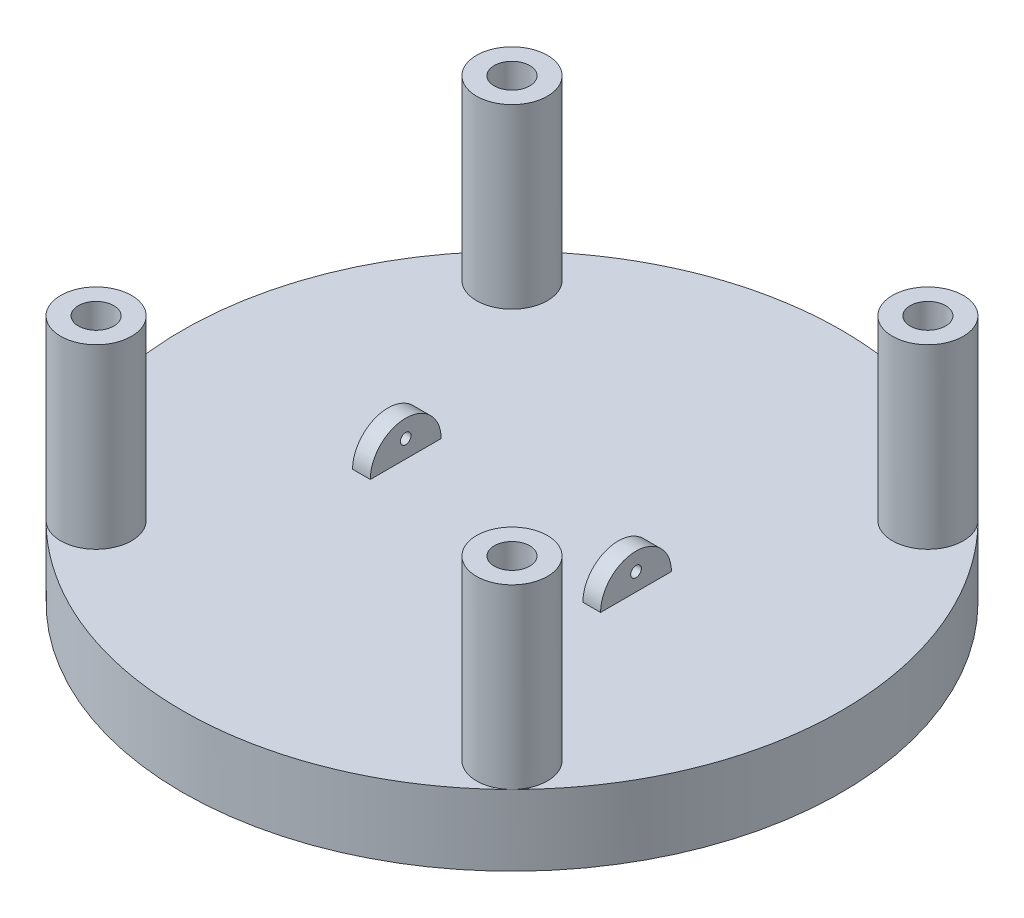
ISO-10303-21;
HEADER;
FILE_DESCRIPTION(('STEP AP214'),'2;1');
FILE_NAME('part.step','',(''),(''),'','','');
FILE_SCHEMA(('AUTOMOTIVE_DESIGN { 1 0 10303 214 1 1 1 1 }'));
ENDSEC;
DATA;
#1=APPLICATION_CONTEXT('core data for automotive mechanical design processes');
#2=APPLICATION_PROTOCOL_DEFINITION('international standard','automotive_design',2000,#1);
#3=PRODUCT_CONTEXT('',#1,'mechanical');
#4=PRODUCT('Part','Part','',(#3));
#5=PRODUCT_RELATED_PRODUCT_CATEGORY('part','',(#4));
#6=PRODUCT_DEFINITION_FORMATION('','',#4);
#7=PRODUCT_DEFINITION_CONTEXT('part definition',#1,'design');
#8=PRODUCT_DEFINITION('design','',#6,#7);
#9=PRODUCT_DEFINITION_SHAPE('','',#8);
#10=(LENGTH_UNIT() NAMED_UNIT(*) SI_UNIT(.MILLI.,.METRE.));
#11=(NAMED_UNIT(*) PLANE_ANGLE_UNIT() SI_UNIT($,.RADIAN.));
#12=(NAMED_UNIT(*) SI_UNIT($,.STERADIAN.) SOLID_ANGLE_UNIT());
#13=UNCERTAINTY_MEASURE_WITH_UNIT(LENGTH_MEASURE(1.E-05),#10,'distance_accuracy_value','');
#14=(GEOMETRIC_REPRESENTATION_CONTEXT(3) GLOBAL_UNCERTAINTY_ASSIGNED_CONTEXT((#13)) GLOBAL_UNIT_ASSIGNED_CONTEXT((#10,
#11,#12)) REPRESENTATION_CONTEXT('',''));
#15=CARTESIAN_POINT('',(0.,0.,0.));
#16=DIRECTION('',(0.,0.,1.));
#17=DIRECTION('',(1.,0.,0.));
#18=AXIS2_PLACEMENT_3D('',#15,#16,#17);
#19=CARTESIAN_POINT('',(0.,17.,0.));
#20=DIRECTION('',(0.,1.,0.));
#21=DIRECTION('',(0.,0.,1.));
#22=AXIS2_PLACEMENT_3D('',#19,#20,#21);
#23=PLANE('',#22);
#24=CARTESIAN_POINT('',(0.,17.,0.));
#25=DIRECTION('',(0.,1.,0.));
#26=DIRECTION('',(0.,0.,1.));
#27=AXIS2_PLACEMENT_3D('',#24,#25,#26);
#28=CIRCLE('',#27,90.);
#29=CARTESIAN_POINT('',(0.,17.,90.));
#30=VERTEX_POINT('',#29);
#31=EDGE_CURVE('E253',#30,#30,#28,.T.);
#32=ORIENTED_EDGE('',*,*,#31,.F.);
#33=EDGE_LOOP('',(#32));
#34=FACE_BOUND('',#33,.T.);
#35=DIRECTION('',(-1.,0.,0.));
#36=VECTOR('',#35,1.);
#37=CARTESIAN_POINT('',(-20.,17.,80.));
#38=LINE('',#37,#36);
#39=CARTESIAN_POINT('',(20.,17.,80.));
#40=VERTEX_POINT('',#39);
#41=CARTESIAN_POINT('',(-20.,17.,80.));
#42=VERTEX_POINT('',#41);
#43=EDGE_CURVE('E197',#40,#42,#38,.T.);
#44=ORIENTED_EDGE('',*,*,#43,.F.);
#45=DIRECTION('',(0.,0.,1.));
#46=VECTOR('',#45,1.);
#47=CARTESIAN_POINT('',(20.,17.,40.));
#48=LINE('',#47,#46);
#49=CARTESIAN_POINT('',(20.,17.,40.));
#50=VERTEX_POINT('',#49);
#51=EDGE_CURVE('E178',#50,#40,#48,.T.);
#52=ORIENTED_EDGE('',*,*,#51,.F.);
#53=DIRECTION('',(1.,0.,0.));
#54=VECTOR('',#53,1.);
#55=CARTESIAN_POINT('',(-20.,17.,40.));
#56=LINE('',#55,#54);
#57=CARTESIAN_POINT('',(-20.,17.,40.));
#58=VERTEX_POINT('',#57);
#59=EDGE_CURVE('E186',#58,#50,#56,.T.);
#60=ORIENTED_EDGE('',*,*,#59,.F.);
#61=DIRECTION('',(0.,0.,-1.));
#62=VECTOR('',#61,1.);
#63=CARTESIAN_POINT('',(-20.,17.,40.));
#64=LINE('',#63,#62);
#65=EDGE_CURVE('E200',#42,#58,#64,.T.);
#66=ORIENTED_EDGE('',*,*,#65,.F.);
#67=EDGE_LOOP('',(#44,#52,#60,#66));
#68=FACE_BOUND('',#67,.T.);
#69=DIRECTION('',(0.,0.,-1.));
#70=VECTOR('',#69,1.);
#71=CARTESIAN_POINT('',(20.,17.,-40.));
#72=LINE('',#71,#70);
#73=CARTESIAN_POINT('',(20.,17.,-40.));
#74=VERTEX_POINT('',#73);
#75=CARTESIAN_POINT('',(20.,17.,-80.));
#76=VERTEX_POINT('',#75);
#77=EDGE_CURVE('E155',#74,#76,#72,.T.);
#78=ORIENTED_EDGE('',*,*,#77,.T.);
#79=DIRECTION('',(-1.,0.,0.));
#80=VECTOR('',#79,1.);
#81=CARTESIAN_POINT('',(-20.,17.,-80.));
#82=LINE('',#81,#80);
#83=CARTESIAN_POINT('',(-20.,17.,-80.));
#84=VERTEX_POINT('',#83);
#85=EDGE_CURVE('E159',#76,#84,#82,.T.);
#86=ORIENTED_EDGE('',*,*,#85,.T.);
#87=DIRECTION('',(0.,0.,1.));
#88=VECTOR('',#87,1.);
#89=CARTESIAN_POINT('',(-20.,17.,-40.));
#90=LINE('',#89,#88);
#91=CARTESIAN_POINT('',(-20.,17.,-40.));
#92=VERTEX_POINT('',#91);
#93=EDGE_CURVE('E162',#84,#92,#90,.T.);
#94=ORIENTED_EDGE('',*,*,#93,.T.);
#95=DIRECTION('',(1.,0.,0.));
#96=VECTOR('',#95,1.);
#97=CARTESIAN_POINT('',(-20.,17.,-40.));
#98=LINE('',#97,#96);
#99=EDGE_CURVE('E171',#92,#74,#98,.T.);
#100=ORIENTED_EDGE('',*,*,#99,.T.);
#101=EDGE_LOOP('',(#78,#86,#94,#100));
#102=FACE_BOUND('',#101,.T.);
#103=ADVANCED_FACE('F33',(#34,#68,#102),#23,.F.);
#104=CARTESIAN_POINT('',(0.,20.,0.));
#105=DIRECTION('',(0.,1.,0.));
#106=DIRECTION('',(0.,0.,1.));
#107=AXIS2_PLACEMENT_3D('',#104,#105,#106);
#108=PLANE('',#107);
#109=CARTESIAN_POINT('',(0.,20.,0.));
#110=DIRECTION('',(0.,1.,0.));
#111=DIRECTION('',(0.,0.,1.));
#112=AXIS2_PLACEMENT_3D('',#109,#110,#111);
#113=CIRCLE('',#112,93.);
#114=CARTESIAN_POINT('',(65.7609306503493,20.,65.7609306503486));
#115=VERTEX_POINT('',#114);
#116=CARTESIAN_POINT('',(65.7609306503479,20.,-65.76093065035));
#117=VERTEX_POINT('',#116);
#118=EDGE_CURVE('E749',#115,#117,#113,.T.);
#119=ORIENTED_EDGE('',*,*,#118,.T.);
#120=CARTESIAN_POINT('',(58.6898628384825,20.,-58.6898628384844));
#121=DIRECTION('',(0.,1.,0.));
#122=DIRECTION('',(-1.,0.,0.));
#123=AXIS2_PLACEMENT_3D('',#120,#121,#122);
#124=CIRCLE('',#123,10.);
#125=EDGE_CURVE('E49',#117,#117,#124,.T.);
#126=ORIENTED_EDGE('',*,*,#125,.F.);
#127=CARTESIAN_POINT('',(-65.7609306503493,20.,-65.7609306503486));
#128=VERTEX_POINT('',#127);
#129=EDGE_CURVE('E44',#117,#128,#113,.T.);
#130=ORIENTED_EDGE('',*,*,#129,.T.);
#131=CARTESIAN_POINT('',(-58.6898628384838,20.,-58.6898628384831));
#132=DIRECTION('',(0.,1.,0.));
#133=DIRECTION('',(0.,0.,1.));
#134=AXIS2_PLACEMENT_3D('',#131,#132,#133);
#135=CIRCLE('',#134,10.);
#136=EDGE_CURVE('E165',#128,#128,#135,.T.);
#137=ORIENTED_EDGE('',*,*,#136,.F.);
#138=CARTESIAN_POINT('',(-65.7609306503483,20.,65.7609306503495));
#139=VERTEX_POINT('',#138);
#140=EDGE_CURVE('E11',#128,#139,#113,.T.);
#141=ORIENTED_EDGE('',*,*,#140,.T.);
#142=CARTESIAN_POINT('',(-58.6898628384829,20.,58.689862838484));
#143=DIRECTION('',(0.,1.,0.));
#144=DIRECTION('',(1.,0.,0.));
#145=AXIS2_PLACEMENT_3D('',#142,#143,#144);
#146=CIRCLE('',#145,10.);
#147=EDGE_CURVE('E323',#139,#139,#146,.T.);
#148=ORIENTED_EDGE('',*,*,#147,.F.);
#149=EDGE_CURVE('E42',#139,#115,#113,.T.);
#150=ORIENTED_EDGE('',*,*,#149,.T.);
#151=CARTESIAN_POINT('',(58.6898628384838,20.,58.6898628384831));
#152=DIRECTION('',(0.,1.,0.));
#153=DIRECTION('',(0.,0.,-1.));
#154=AXIS2_PLACEMENT_3D('',#151,#152,#153);
#155=CIRCLE('',#154,10.);
#156=EDGE_CURVE('E54',#115,#115,#155,.T.);
#157=ORIENTED_EDGE('',*,*,#156,.F.);
#158=EDGE_LOOP('',(#119,#126,#130,#137,#141,#148,#150,#157));
#159=FACE_BOUND('',#158,.T.);
#160=DIRECTION('',(0.,0.,-1.));
#161=VECTOR('',#160,1.);
#162=CARTESIAN_POINT('',(-35.,19.9999999999999,9.99999999999999));
#163=LINE('',#162,#161);
#164=CARTESIAN_POINT('',(-35.,20.,10.));
#165=VERTEX_POINT('',#164);
#166=CARTESIAN_POINT('',(-35.,20.,-9.99999999999999));
#167=VERTEX_POINT('',#166);
#168=EDGE_CURVE('E238',#165,#167,#163,.T.);
#169=ORIENTED_EDGE('',*,*,#168,.T.);
#170=DIRECTION('',(-1.,0.,0.));
#171=VECTOR('',#170,1.);
#172=CARTESIAN_POINT('',(-35.,20.,-9.99999999999999));
#173=LINE('',#172,#171);
#174=CARTESIAN_POINT('',(-30.,20.,-10.));
#175=VERTEX_POINT('',#174);
#176=EDGE_CURVE('E235',#175,#167,#173,.T.);
#177=ORIENTED_EDGE('',*,*,#176,.F.);
#178=DIRECTION('',(0.,0.,1.));
#179=VECTOR('',#178,1.);
#180=CARTESIAN_POINT('',(-30.,19.9999999999999,10.));
#181=LINE('',#180,#179);
#182=CARTESIAN_POINT('',(-30.,19.9999999999999,10.));
#183=VERTEX_POINT('',#182);
#184=EDGE_CURVE('E241',#175,#183,#181,.T.);
#185=ORIENTED_EDGE('',*,*,#184,.T.);
#186=DIRECTION('',(-1.,0.,0.));
#187=VECTOR('',#186,1.);
#188=CARTESIAN_POINT('',(-35.,19.9999999999999,9.99999999999999));
#189=LINE('',#188,#187);
#190=EDGE_CURVE('E244',#183,#165,#189,.T.);
#191=ORIENTED_EDGE('',*,*,#190,.T.);
#192=EDGE_LOOP('',(#169,#177,#185,#191));
#193=FACE_BOUND('',#192,.T.);
#194=DIRECTION('',(0.,0.,-1.));
#195=VECTOR('',#194,1.);
#196=CARTESIAN_POINT('',(35.,19.9999999999999,9.99999999999999));
#197=LINE('',#196,#195);
#198=CARTESIAN_POINT('',(35.,19.9999999999999,9.99999999999999));
#199=VERTEX_POINT('',#198);
#200=CARTESIAN_POINT('',(35.,20.,-10.));
#201=VERTEX_POINT('',#200);
#202=EDGE_CURVE('E219',#199,#201,#197,.T.);
#203=ORIENTED_EDGE('',*,*,#202,.F.);
#204=DIRECTION('',(1.,0.,0.));
#205=VECTOR('',#204,1.);
#206=CARTESIAN_POINT('',(35.,19.9999999999999,9.99999999999999));
#207=LINE('',#206,#205);
#208=CARTESIAN_POINT('',(30.,19.9999999999999,10.));
#209=VERTEX_POINT('',#208);
#210=EDGE_CURVE('E224',#209,#199,#207,.T.);
#211=ORIENTED_EDGE('',*,*,#210,.F.);
#212=DIRECTION('',(0.,0.,1.));
#213=VECTOR('',#212,1.);
#214=CARTESIAN_POINT('',(30.,19.9999999999999,10.));
#215=LINE('',#214,#213);
#216=CARTESIAN_POINT('',(30.,20.,-10.));
#217=VERTEX_POINT('',#216);
#218=EDGE_CURVE('E222',#217,#209,#215,.T.);
#219=ORIENTED_EDGE('',*,*,#218,.F.);
#220=DIRECTION('',(1.,0.,0.));
#221=VECTOR('',#220,1.);
#222=CARTESIAN_POINT('',(35.,20.,-9.99999999999999));
#223=LINE('',#222,#221);
#224=EDGE_CURVE('E216',#217,#201,#223,.T.);
#225=ORIENTED_EDGE('',*,*,#224,.T.);
#226=EDGE_LOOP('',(#203,#211,#219,#225));
#227=FACE_BOUND('',#226,.T.);
#228=ADVANCED_FACE('F284',(#159,#193,#227),#108,.T.);
#229=CARTESIAN_POINT('',(0.,20.,0.));
#230=DIRECTION('',(0.,-1.,0.));
#231=DIRECTION('',(0.,0.,-1.));
#232=AXIS2_PLACEMENT_3D('',#229,#230,#231);
#233=CYLINDRICAL_SURFACE('',#232,93.);
#234=ORIENTED_EDGE('',*,*,#140,.F.);
#235=ORIENTED_EDGE('',*,*,#129,.F.);
#236=ORIENTED_EDGE('',*,*,#118,.F.);
#237=ORIENTED_EDGE('',*,*,#149,.F.);
#238=EDGE_LOOP('',(#234,#235,#236,#237));
#239=FACE_BOUND('',#238,.T.);
#240=CARTESIAN_POINT('',(0.,0.,0.));
#241=DIRECTION('',(0.,1.,0.));
#242=DIRECTION('',(0.,0.,1.));
#243=AXIS2_PLACEMENT_3D('',#240,#241,#242);
#244=CIRCLE('',#243,93.);
#245=CARTESIAN_POINT('',(0.,0.,93.));
#246=VERTEX_POINT('',#245);
#247=EDGE_CURVE('E256',#246,#246,#244,.T.);
#248=ORIENTED_EDGE('',*,*,#247,.T.);
#249=EDGE_LOOP('',(#248));
#250=FACE_BOUND('',#249,.T.);
#251=ADVANCED_FACE('F35',(#239,#250),#233,.T.);
#252=CARTESIAN_POINT('',(0.,0.,0.));
#253=DIRECTION('',(0.,1.,0.));
#254=DIRECTION('',(0.,0.,1.));
#255=AXIS2_PLACEMENT_3D('',#252,#253,#254);
#256=PLANE('',#255);
#257=CARTESIAN_POINT('',(0.,0.,0.));
#258=DIRECTION('',(0.,1.,0.));
#259=DIRECTION('',(0.,0.,1.));
#260=AXIS2_PLACEMENT_3D('',#257,#258,#259);
#261=CIRCLE('',#260,90.);
#262=CARTESIAN_POINT('',(0.,0.,90.));
#263=VERTEX_POINT('',#262);
#264=EDGE_CURVE('E252',#263,#263,#261,.T.);
#265=ORIENTED_EDGE('',*,*,#264,.T.);
#266=EDGE_LOOP('',(#265));
#267=FACE_BOUND('',#266,.T.);
#268=ORIENTED_EDGE('',*,*,#247,.F.);
#269=EDGE_LOOP('',(#268));
#270=FACE_BOUND('',#269,.T.);
#271=ADVANCED_FACE('F297',(#267,#270),#256,.F.);
#272=CARTESIAN_POINT('',(0.,20.,0.));
#273=DIRECTION('',(0.,-1.,0.));
#274=DIRECTION('',(0.,0.,-1.));
#275=AXIS2_PLACEMENT_3D('',#272,#273,#274);
#276=CYLINDRICAL_SURFACE('',#275,90.);
#277=ORIENTED_EDGE('',*,*,#31,.T.);
#278=EDGE_LOOP('',(#277));
#279=FACE_BOUND('',#278,.T.);
#280=ORIENTED_EDGE('',*,*,#264,.F.);
#281=EDGE_LOOP('',(#280));
#282=FACE_BOUND('',#281,.T.);
#283=ADVANCED_FACE('F295',(#279,#282),#276,.F.);
#284=CARTESIAN_POINT('',(-35.,19.9999999999999,9.99999999999999));
#285=DIRECTION('',(1.,0.,0.));
#286=DIRECTION('',(0.,0.,-1.));
#287=AXIS2_PLACEMENT_3D('',#284,#285,#286);
#288=PLANE('',#287);
#289=CARTESIAN_POINT('',(-35.,25.,0.));
#290=DIRECTION('',(-1.,0.,0.));
#291=DIRECTION('',(0.,0.,1.));
#292=AXIS2_PLACEMENT_3D('',#289,#290,#291);
#293=CIRCLE('',#292,1.5);
#294=CARTESIAN_POINT('',(-35.,25.,1.5));
#295=VERTEX_POINT('',#294);
#296=EDGE_CURVE('E231',#295,#295,#293,.T.);
#297=ORIENTED_EDGE('',*,*,#296,.F.);
#298=EDGE_LOOP('',(#297));
#299=FACE_BOUND('',#298,.T.);
#300=CARTESIAN_POINT('',(-35.,20.,0.));
#301=DIRECTION('',(-1.,0.,0.));
#302=DIRECTION('',(0.,0.,1.));
#303=AXIS2_PLACEMENT_3D('',#300,#301,#302);
#304=CIRCLE('',#303,9.99999999999999);
#305=EDGE_CURVE('E247',#165,#167,#304,.T.);
#306=ORIENTED_EDGE('',*,*,#305,.T.);
#307=ORIENTED_EDGE('',*,*,#168,.F.);
#308=EDGE_LOOP('',(#306,#307));
#309=FACE_BOUND('',#308,.T.);
#310=ADVANCED_FACE('F304',(#299,#309),#288,.F.);
#311=CARTESIAN_POINT('',(-30.,19.9999999999999,10.));
#312=DIRECTION('',(-1.,0.,0.));
#313=DIRECTION('',(0.,0.,1.));
#314=AXIS2_PLACEMENT_3D('',#311,#312,#313);
#315=PLANE('',#314);
#316=CARTESIAN_POINT('',(-30.,25.,0.));
#317=DIRECTION('',(-1.,0.,0.));
#318=DIRECTION('',(0.,0.,1.));
#319=AXIS2_PLACEMENT_3D('',#316,#317,#318);
#320=CIRCLE('',#319,1.5);
#321=CARTESIAN_POINT('',(-30.,25.,1.5));
#322=VERTEX_POINT('',#321);
#323=EDGE_CURVE('E234',#322,#322,#320,.T.);
#324=ORIENTED_EDGE('',*,*,#323,.T.);
#325=EDGE_LOOP('',(#324));
#326=FACE_BOUND('',#325,.T.);
#327=CARTESIAN_POINT('',(-30.,20.,0.));
#328=DIRECTION('',(-1.,0.,0.));
#329=DIRECTION('',(0.,0.,1.));
#330=AXIS2_PLACEMENT_3D('',#327,#328,#329);
#331=CIRCLE('',#330,10.);
#332=EDGE_CURVE('E249',#183,#175,#331,.T.);
#333=ORIENTED_EDGE('',*,*,#332,.F.);
#334=ORIENTED_EDGE('',*,*,#184,.F.);
#335=EDGE_LOOP('',(#333,#334));
#336=FACE_BOUND('',#335,.T.);
#337=ADVANCED_FACE('F263',(#326,#336),#315,.F.);
#338=CARTESIAN_POINT('',(0.,20.,0.));
#339=DIRECTION('',(-1.,0.,0.));
#340=DIRECTION('',(0.,0.,1.));
#341=AXIS2_PLACEMENT_3D('',#338,#339,#340);
#342=CYLINDRICAL_SURFACE('',#341,10.);
#343=ORIENTED_EDGE('',*,*,#190,.F.);
#344=ORIENTED_EDGE('',*,*,#332,.T.);
#345=ORIENTED_EDGE('',*,*,#176,.T.);
#346=ORIENTED_EDGE('',*,*,#305,.F.);
#347=EDGE_LOOP('',(#343,#344,#345,#346));
#348=FACE_BOUND('',#347,.T.);
#349=ADVANCED_FACE('F269',(#348),#342,.T.);
#350=CARTESIAN_POINT('',(-25.,25.,0.));
#351=DIRECTION('',(-1.,0.,0.));
#352=DIRECTION('',(0.,0.,1.));
#353=AXIS2_PLACEMENT_3D('',#350,#351,#352);
#354=CYLINDRICAL_SURFACE('',#353,1.5);
#355=ORIENTED_EDGE('',*,*,#296,.T.);
#356=EDGE_LOOP('',(#355));
#357=FACE_BOUND('',#356,.T.);
#358=ORIENTED_EDGE('',*,*,#323,.F.);
#359=EDGE_LOOP('',(#358));
#360=FACE_BOUND('',#359,.T.);
#361=ADVANCED_FACE('F266',(#357,#360),#354,.F.);
#362=CARTESIAN_POINT('',(35.,19.9999999999999,9.99999999999999));
#363=DIRECTION('',(-1.,0.,0.));
#364=DIRECTION('',(0.,0.,-1.));
#365=AXIS2_PLACEMENT_3D('',#362,#363,#364);
#366=PLANE('',#365);
#367=CARTESIAN_POINT('',(35.,25.,0.));
#368=DIRECTION('',(-1.,0.,0.));
#369=DIRECTION('',(0.,0.,1.));
#370=AXIS2_PLACEMENT_3D('',#367,#368,#369);
#371=CIRCLE('',#370,1.5);
#372=CARTESIAN_POINT('',(35.,25.,1.5));
#373=VERTEX_POINT('',#372);
#374=EDGE_CURVE('E207',#373,#373,#371,.T.);
#375=ORIENTED_EDGE('',*,*,#374,.T.);
#376=EDGE_LOOP('',(#375));
#377=FACE_BOUND('',#376,.T.);
#378=ORIENTED_EDGE('',*,*,#202,.T.);
#379=CARTESIAN_POINT('',(35.,20.,0.));
#380=DIRECTION('',(-1.,0.,0.));
#381=DIRECTION('',(0.,0.,1.));
#382=AXIS2_PLACEMENT_3D('',#379,#380,#381);
#383=CIRCLE('',#382,9.99999999999999);
#384=EDGE_CURVE('E226',#199,#201,#383,.T.);
#385=ORIENTED_EDGE('',*,*,#384,.F.);
#386=EDGE_LOOP('',(#378,#385));
#387=FACE_BOUND('',#386,.T.);
#388=ADVANCED_FACE('F268',(#377,#387),#366,.F.);
#389=CARTESIAN_POINT('',(30.,19.9999999999999,10.));
#390=DIRECTION('',(1.,0.,0.));
#391=DIRECTION('',(0.,0.,1.));
#392=AXIS2_PLACEMENT_3D('',#389,#390,#391);
#393=PLANE('',#392);
#394=CARTESIAN_POINT('',(30.,25.,0.));
#395=DIRECTION('',(1.,0.,0.));
#396=DIRECTION('',(0.,0.,-1.));
#397=AXIS2_PLACEMENT_3D('',#394,#395,#396);
#398=CIRCLE('',#397,1.5);
#399=CARTESIAN_POINT('',(30.,25.,-1.5));
#400=VERTEX_POINT('',#399);
#401=EDGE_CURVE('E37',#400,#400,#398,.F.);
#402=ORIENTED_EDGE('',*,*,#401,.F.);
#403=EDGE_LOOP('',(#402));
#404=FACE_BOUND('',#403,.T.);
#405=CARTESIAN_POINT('',(30.,20.,0.));
#406=DIRECTION('',(-1.,0.,0.));
#407=DIRECTION('',(0.,0.,1.));
#408=AXIS2_PLACEMENT_3D('',#405,#406,#407);
#409=CIRCLE('',#408,10.);
#410=EDGE_CURVE('E228',#209,#217,#409,.T.);
#411=ORIENTED_EDGE('',*,*,#410,.T.);
#412=ORIENTED_EDGE('',*,*,#218,.T.);
#413=EDGE_LOOP('',(#411,#412));
#414=FACE_BOUND('',#413,.T.);
#415=ADVANCED_FACE('F276',(#404,#414),#393,.F.);
#416=CARTESIAN_POINT('',(0.,20.,0.));
#417=DIRECTION('',(1.,0.,0.));
#418=DIRECTION('',(0.,0.,1.));
#419=AXIS2_PLACEMENT_3D('',#416,#417,#418);
#420=CYLINDRICAL_SURFACE('',#419,10.);
#421=ORIENTED_EDGE('',*,*,#210,.T.);
#422=ORIENTED_EDGE('',*,*,#384,.T.);
#423=ORIENTED_EDGE('',*,*,#224,.F.);
#424=ORIENTED_EDGE('',*,*,#410,.F.);
#425=EDGE_LOOP('',(#421,#422,#423,#424));
#426=FACE_BOUND('',#425,.T.);
#427=ADVANCED_FACE('F442',(#426),#420,.T.);
#428=CARTESIAN_POINT('',(25.,25.,0.));
#429=DIRECTION('',(1.,0.,0.));
#430=DIRECTION('',(0.,0.,-1.));
#431=AXIS2_PLACEMENT_3D('',#428,#429,#430);
#432=CYLINDRICAL_SURFACE('',#431,1.5);
#433=ORIENTED_EDGE('',*,*,#374,.F.);
#434=EDGE_LOOP('',(#433));
#435=FACE_BOUND('',#434,.T.);
#436=ORIENTED_EDGE('',*,*,#401,.T.);
#437=EDGE_LOOP('',(#436));
#438=FACE_BOUND('',#437,.T.);
#439=ADVANCED_FACE('F439',(#435,#438),#432,.F.);
#440=CARTESIAN_POINT('',(20.,19.,40.));
#441=DIRECTION('',(1.,0.,0.));
#442=DIRECTION('',(0.,0.,-1.));
#443=AXIS2_PLACEMENT_3D('',#440,#441,#442);
#444=PLANE('',#443);
#445=ORIENTED_EDGE('',*,*,#51,.T.);
#446=DIRECTION('',(0.,-1.,0.));
#447=VECTOR('',#446,1.);
#448=CARTESIAN_POINT('',(20.,19.,80.));
#449=LINE('',#448,#447);
#450=CARTESIAN_POINT('',(20.,19.,80.));
#451=VERTEX_POINT('',#450);
#452=EDGE_CURVE('E195',#451,#40,#449,.T.);
#453=ORIENTED_EDGE('',*,*,#452,.F.);
#454=DIRECTION('',(0.,0.,1.));
#455=VECTOR('',#454,1.);
#456=CARTESIAN_POINT('',(20.,19.,40.));
#457=LINE('',#456,#455);
#458=CARTESIAN_POINT('',(20.,19.,40.));
#459=VERTEX_POINT('',#458);
#460=EDGE_CURVE('E182',#459,#451,#457,.T.);
#461=ORIENTED_EDGE('',*,*,#460,.F.);
#462=DIRECTION('',(0.,-1.,0.));
#463=VECTOR('',#462,1.);
#464=CARTESIAN_POINT('',(20.,19.,40.));
#465=LINE('',#464,#463);
#466=EDGE_CURVE('E205',#459,#50,#465,.T.);
#467=ORIENTED_EDGE('',*,*,#466,.T.);
#468=EDGE_LOOP('',(#445,#453,#461,#467));
#469=FACE_BOUND('',#468,.T.);
#470=ADVANCED_FACE('F429',(#469),#444,.F.);
#471=CARTESIAN_POINT('',(-20.,19.,40.));
#472=DIRECTION('',(0.,0.,-1.));
#473=DIRECTION('',(-1.,0.,0.));
#474=AXIS2_PLACEMENT_3D('',#471,#472,#473);
#475=PLANE('',#474);
#476=ORIENTED_EDGE('',*,*,#59,.T.);
#477=ORIENTED_EDGE('',*,*,#466,.F.);
#478=DIRECTION('',(1.,0.,0.));
#479=VECTOR('',#478,1.);
#480=CARTESIAN_POINT('',(-20.,19.,40.));
#481=LINE('',#480,#479);
#482=CARTESIAN_POINT('',(-20.,19.,40.));
#483=VERTEX_POINT('',#482);
#484=EDGE_CURVE('E192',#483,#459,#481,.T.);
#485=ORIENTED_EDGE('',*,*,#484,.F.);
#486=DIRECTION('',(0.,-1.,0.));
#487=VECTOR('',#486,1.);
#488=CARTESIAN_POINT('',(-20.,19.,40.));
#489=LINE('',#488,#487);
#490=EDGE_CURVE('E208',#483,#58,#489,.T.);
#491=ORIENTED_EDGE('',*,*,#490,.T.);
#492=EDGE_LOOP('',(#476,#477,#485,#491));
#493=FACE_BOUND('',#492,.T.);
#494=ADVANCED_FACE('F425',(#493),#475,.F.);
#495=CARTESIAN_POINT('',(-20.,19.,40.));
#496=DIRECTION('',(-1.,0.,0.));
#497=DIRECTION('',(0.,0.,1.));
#498=AXIS2_PLACEMENT_3D('',#495,#496,#497);
#499=PLANE('',#498);
#500=ORIENTED_EDGE('',*,*,#65,.T.);
#501=ORIENTED_EDGE('',*,*,#490,.F.);
#502=DIRECTION('',(0.,0.,-1.));
#503=VECTOR('',#502,1.);
#504=CARTESIAN_POINT('',(-20.,19.,40.));
#505=LINE('',#504,#503);
#506=CARTESIAN_POINT('',(-20.,19.,80.));
#507=VERTEX_POINT('',#506);
#508=EDGE_CURVE('E189',#507,#483,#505,.T.);
#509=ORIENTED_EDGE('',*,*,#508,.F.);
#510=DIRECTION('',(0.,-1.,0.));
#511=VECTOR('',#510,1.);
#512=CARTESIAN_POINT('',(-20.,19.,80.));
#513=LINE('',#512,#511);
#514=EDGE_CURVE('E210',#507,#42,#513,.T.);
#515=ORIENTED_EDGE('',*,*,#514,.T.);
#516=EDGE_LOOP('',(#500,#501,#509,#515));
#517=FACE_BOUND('',#516,.T.);
#518=ADVANCED_FACE('F428',(#517),#499,.F.);
#519=CARTESIAN_POINT('',(-20.,19.,80.));
#520=DIRECTION('',(0.,0.,1.));
#521=DIRECTION('',(1.,0.,0.));
#522=AXIS2_PLACEMENT_3D('',#519,#520,#521);
#523=PLANE('',#522);
#524=ORIENTED_EDGE('',*,*,#43,.T.);
#525=ORIENTED_EDGE('',*,*,#514,.F.);
#526=DIRECTION('',(-1.,0.,0.));
#527=VECTOR('',#526,1.);
#528=CARTESIAN_POINT('',(-20.,19.,80.));
#529=LINE('',#528,#527);
#530=EDGE_CURVE('E185',#451,#507,#529,.T.);
#531=ORIENTED_EDGE('',*,*,#530,.F.);
#532=ORIENTED_EDGE('',*,*,#452,.T.);
#533=EDGE_LOOP('',(#524,#525,#531,#532));
#534=FACE_BOUND('',#533,.T.);
#535=ADVANCED_FACE('F423',(#534),#523,.F.);
#536=CARTESIAN_POINT('',(0.,19.,0.));
#537=DIRECTION('',(0.,1.,0.));
#538=DIRECTION('',(0.,0.,1.));
#539=AXIS2_PLACEMENT_3D('',#536,#537,#538);
#540=PLANE('',#539);
#541=ORIENTED_EDGE('',*,*,#460,.T.);
#542=ORIENTED_EDGE('',*,*,#530,.T.);
#543=ORIENTED_EDGE('',*,*,#508,.T.);
#544=ORIENTED_EDGE('',*,*,#484,.T.);
#545=EDGE_LOOP('',(#541,#542,#543,#544));
#546=FACE_BOUND('',#545,.T.);
#547=ADVANCED_FACE('F420',(#546),#540,.F.);
#548=CARTESIAN_POINT('',(20.,19.,-40.));
#549=DIRECTION('',(-1.,0.,0.));
#550=DIRECTION('',(0.,0.,1.));
#551=AXIS2_PLACEMENT_3D('',#548,#549,#550);
#552=PLANE('',#551);
#553=ORIENTED_EDGE('',*,*,#77,.F.);
#554=DIRECTION('',(0.,-1.,0.));
#555=VECTOR('',#554,1.);
#556=CARTESIAN_POINT('',(20.,19.,-40.));
#557=LINE('',#556,#555);
#558=CARTESIAN_POINT('',(20.,19.,-40.));
#559=VERTEX_POINT('',#558);
#560=EDGE_CURVE('E140',#559,#74,#557,.T.);
#561=ORIENTED_EDGE('',*,*,#560,.F.);
#562=DIRECTION('',(0.,0.,-1.));
#563=VECTOR('',#562,1.);
#564=CARTESIAN_POINT('',(20.,19.,-40.));
#565=LINE('',#564,#563);
#566=CARTESIAN_POINT('',(20.,19.,-80.));
#567=VERTEX_POINT('',#566);
#568=EDGE_CURVE('E147',#559,#567,#565,.T.);
#569=ORIENTED_EDGE('',*,*,#568,.T.);
#570=DIRECTION('',(0.,-1.,0.));
#571=VECTOR('',#570,1.);
#572=CARTESIAN_POINT('',(20.,19.,-80.));
#573=LINE('',#572,#571);
#574=EDGE_CURVE('E176',#567,#76,#573,.T.);
#575=ORIENTED_EDGE('',*,*,#574,.T.);
#576=EDGE_LOOP('',(#553,#561,#569,#575));
#577=FACE_BOUND('',#576,.T.);
#578=ADVANCED_FACE('F151',(#577),#552,.T.);
#579=CARTESIAN_POINT('',(-20.,19.,-80.));
#580=DIRECTION('',(0.,0.,1.));
#581=DIRECTION('',(1.,0.,0.));
#582=AXIS2_PLACEMENT_3D('',#579,#580,#581);
#583=PLANE('',#582);
#584=ORIENTED_EDGE('',*,*,#85,.F.);
#585=ORIENTED_EDGE('',*,*,#574,.F.);
#586=DIRECTION('',(-1.,0.,0.));
#587=VECTOR('',#586,1.);
#588=CARTESIAN_POINT('',(-20.,19.,-80.));
#589=LINE('',#588,#587);
#590=CARTESIAN_POINT('',(-20.,19.,-80.));
#591=VERTEX_POINT('',#590);
#592=EDGE_CURVE('E156',#567,#591,#589,.T.);
#593=ORIENTED_EDGE('',*,*,#592,.T.);
#594=DIRECTION('',(0.,-1.,0.));
#595=VECTOR('',#594,1.);
#596=CARTESIAN_POINT('',(-20.,19.,-80.));
#597=LINE('',#596,#595);
#598=EDGE_CURVE('E179',#591,#84,#597,.T.);
#599=ORIENTED_EDGE('',*,*,#598,.T.);
#600=EDGE_LOOP('',(#584,#585,#593,#599));
#601=FACE_BOUND('',#600,.T.);
#602=ADVANCED_FACE('F408',(#601),#583,.T.);
#603=CARTESIAN_POINT('',(-20.,19.,-40.));
#604=DIRECTION('',(1.,0.,0.));
#605=DIRECTION('',(0.,0.,-1.));
#606=AXIS2_PLACEMENT_3D('',#603,#604,#605);
#607=PLANE('',#606);
#608=ORIENTED_EDGE('',*,*,#93,.F.);
#609=ORIENTED_EDGE('',*,*,#598,.F.);
#610=DIRECTION('',(0.,0.,1.));
#611=VECTOR('',#610,1.);
#612=CARTESIAN_POINT('',(-20.,19.,-40.));
#613=LINE('',#612,#611);
#614=CARTESIAN_POINT('',(-20.,19.,-40.));
#615=VERTEX_POINT('',#614);
#616=EDGE_CURVE('E146',#591,#615,#613,.T.);
#617=ORIENTED_EDGE('',*,*,#616,.T.);
#618=DIRECTION('',(0.,-1.,0.));
#619=VECTOR('',#618,1.);
#620=CARTESIAN_POINT('',(-20.,19.,-40.));
#621=LINE('',#620,#619);
#622=EDGE_CURVE('E142',#615,#92,#621,.T.);
#623=ORIENTED_EDGE('',*,*,#622,.T.);
#624=EDGE_LOOP('',(#608,#609,#617,#623));
#625=FACE_BOUND('',#624,.T.);
#626=ADVANCED_FACE('F411',(#625),#607,.T.);
#627=CARTESIAN_POINT('',(-20.,19.,-40.));
#628=DIRECTION('',(0.,0.,-1.));
#629=DIRECTION('',(-1.,0.,0.));
#630=AXIS2_PLACEMENT_3D('',#627,#628,#629);
#631=PLANE('',#630);
#632=ORIENTED_EDGE('',*,*,#99,.F.);
#633=ORIENTED_EDGE('',*,*,#622,.F.);
#634=DIRECTION('',(1.,0.,0.));
#635=VECTOR('',#634,1.);
#636=CARTESIAN_POINT('',(-20.,19.,-40.));
#637=LINE('',#636,#635);
#638=EDGE_CURVE('E136',#615,#559,#637,.T.);
#639=ORIENTED_EDGE('',*,*,#638,.T.);
#640=ORIENTED_EDGE('',*,*,#560,.T.);
#641=EDGE_LOOP('',(#632,#633,#639,#640));
#642=FACE_BOUND('',#641,.T.);
#643=ADVANCED_FACE('F139',(#642),#631,.T.);
#644=CARTESIAN_POINT('',(0.,19.,0.));
#645=DIRECTION('',(0.,1.,0.));
#646=DIRECTION('',(0.,0.,-1.));
#647=AXIS2_PLACEMENT_3D('',#644,#645,#646);
#648=PLANE('',#647);
#649=ORIENTED_EDGE('',*,*,#568,.F.);
#650=ORIENTED_EDGE('',*,*,#638,.F.);
#651=ORIENTED_EDGE('',*,*,#616,.F.);
#652=ORIENTED_EDGE('',*,*,#592,.F.);
#653=EDGE_LOOP('',(#649,#650,#651,#652));
#654=FACE_BOUND('',#653,.T.);
#655=ADVANCED_FACE('F158',(#654),#648,.F.);
#656=CARTESIAN_POINT('',(-58.6898628384838,70.,-58.6898628384831));
#657=DIRECTION('',(0.,-1.,0.));
#658=DIRECTION('',(0.,0.,-1.));
#659=AXIS2_PLACEMENT_3D('',#656,#657,#658);
#660=CYLINDRICAL_SURFACE('',#659,10.);
#661=CARTESIAN_POINT('',(-58.6898628384838,70.,-58.6898628384831));
#662=DIRECTION('',(0.,1.,0.));
#663=DIRECTION('',(0.,0.,1.));
#664=AXIS2_PLACEMENT_3D('',#661,#662,#663);
#665=CIRCLE('',#664,10.);
#666=CARTESIAN_POINT('',(-58.6898628384838,70.,-48.6898628384831));
#667=VERTEX_POINT('',#666);
#668=EDGE_CURVE('E172',#667,#667,#665,.T.);
#669=ORIENTED_EDGE('',*,*,#668,.F.);
#670=EDGE_LOOP('',(#669));
#671=FACE_BOUND('',#670,.T.);
#672=ORIENTED_EDGE('',*,*,#136,.T.);
#673=EDGE_LOOP('',(#672));
#674=FACE_BOUND('',#673,.T.);
#675=ADVANCED_FACE('F401',(#671,#674),#660,.T.);
#676=CARTESIAN_POINT('',(-58.6898628384838,70.,-58.6898628384831));
#677=DIRECTION('',(0.,1.,0.));
#678=DIRECTION('',(0.,0.,1.));
#679=AXIS2_PLACEMENT_3D('',#676,#677,#678);
#680=PLANE('',#679);
#681=CARTESIAN_POINT('',(-58.6898628384838,70.,-58.6898628384831));
#682=DIRECTION('',(0.,1.,0.));
#683=DIRECTION('',(0.,0.,1.));
#684=AXIS2_PLACEMENT_3D('',#681,#682,#683);
#685=CIRCLE('',#684,5.);
#686=CARTESIAN_POINT('',(-58.6898628384838,70.,-53.6898628384831));
#687=VERTEX_POINT('',#686);
#688=EDGE_CURVE('E329',#687,#687,#685,.T.);
#689=ORIENTED_EDGE('',*,*,#688,.F.);
#690=EDGE_LOOP('',(#689));
#691=FACE_BOUND('',#690,.T.);
#692=ORIENTED_EDGE('',*,*,#668,.T.);
#693=EDGE_LOOP('',(#692));
#694=FACE_BOUND('',#693,.T.);
#695=ADVANCED_FACE('F397',(#691,#694),#680,.T.);
#696=CARTESIAN_POINT('',(-58.6898628384838,50.,-58.6898628384831));
#697=DIRECTION('',(0.,1.,0.));
#698=DIRECTION('',(0.,0.,1.));
#699=AXIS2_PLACEMENT_3D('',#696,#697,#698);
#700=CYLINDRICAL_SURFACE('',#699,5.);
#701=CARTESIAN_POINT('',(-58.6898628384838,50.,-58.6898628384831));
#702=DIRECTION('',(0.,1.,0.));
#703=DIRECTION('',(0.,0.,1.));
#704=AXIS2_PLACEMENT_3D('',#701,#702,#703);
#705=CIRCLE('',#704,5.);
#706=CARTESIAN_POINT('',(-58.6898628384838,50.,-53.6898628384831));
#707=VERTEX_POINT('',#706);
#708=EDGE_CURVE('E326',#707,#707,#705,.T.);
#709=ORIENTED_EDGE('',*,*,#708,.F.);
#710=EDGE_LOOP('',(#709));
#711=FACE_BOUND('',#710,.T.);
#712=ORIENTED_EDGE('',*,*,#688,.T.);
#713=EDGE_LOOP('',(#712));
#714=FACE_BOUND('',#713,.T.);
#715=ADVANCED_FACE('F391',(#711,#714),#700,.F.);
#716=CARTESIAN_POINT('',(-58.6898628384838,50.,-58.6898628384831));
#717=DIRECTION('',(0.,1.,0.));
#718=DIRECTION('',(0.,0.,1.));
#719=AXIS2_PLACEMENT_3D('',#716,#717,#718);
#720=PLANE('',#719);
#721=ORIENTED_EDGE('',*,*,#708,.T.);
#722=EDGE_LOOP('',(#721));
#723=FACE_BOUND('',#722,.T.);
#724=ADVANCED_FACE('F386',(#723),#720,.T.);
#725=CARTESIAN_POINT('',(-58.6898628384829,70.,58.689862838484));
#726=DIRECTION('',(0.,-1.,0.));
#727=DIRECTION('',(0.,0.,-1.));
#728=AXIS2_PLACEMENT_3D('',#725,#726,#727);
#729=CYLINDRICAL_SURFACE('',#728,10.);
#730=CARTESIAN_POINT('',(-58.6898628384829,70.,58.689862838484));
#731=DIRECTION('',(0.,1.,0.));
#732=DIRECTION('',(1.,0.,0.));
#733=AXIS2_PLACEMENT_3D('',#730,#731,#732);
#734=CIRCLE('',#733,10.);
#735=CARTESIAN_POINT('',(-48.6898628384829,70.,58.6898628384839));
#736=VERTEX_POINT('',#735);
#737=EDGE_CURVE('E334',#736,#736,#734,.T.);
#738=ORIENTED_EDGE('',*,*,#737,.F.);
#739=EDGE_LOOP('',(#738));
#740=FACE_BOUND('',#739,.T.);
#741=ORIENTED_EDGE('',*,*,#147,.T.);
#742=EDGE_LOOP('',(#741));
#743=FACE_BOUND('',#742,.T.);
#744=ADVANCED_FACE('F380',(#740,#743),#729,.T.);
#745=CARTESIAN_POINT('',(-58.6898628384829,70.,58.689862838484));
#746=DIRECTION('',(0.,1.,0.));
#747=DIRECTION('',(1.,0.,0.));
#748=AXIS2_PLACEMENT_3D('',#745,#746,#747);
#749=PLANE('',#748);
#750=CARTESIAN_POINT('',(-58.6898628384829,70.,58.689862838484));
#751=DIRECTION('',(0.,1.,0.));
#752=DIRECTION('',(1.,0.,0.));
#753=AXIS2_PLACEMENT_3D('',#750,#751,#752);
#754=CIRCLE('',#753,5.);
#755=CARTESIAN_POINT('',(-53.6898628384829,70.,58.689862838484));
#756=VERTEX_POINT('',#755);
#757=EDGE_CURVE('E361',#756,#756,#754,.T.);
#758=ORIENTED_EDGE('',*,*,#757,.F.);
#759=EDGE_LOOP('',(#758));
#760=FACE_BOUND('',#759,.T.);
#761=ORIENTED_EDGE('',*,*,#737,.T.);
#762=EDGE_LOOP('',(#761));
#763=FACE_BOUND('',#762,.T.);
#764=ADVANCED_FACE('F376',(#760,#763),#749,.T.);
#765=CARTESIAN_POINT('',(58.6898628384838,70.,58.6898628384831));
#766=DIRECTION('',(0.,-1.,0.));
#767=DIRECTION('',(0.,0.,-1.));
#768=AXIS2_PLACEMENT_3D('',#765,#766,#767);
#769=CYLINDRICAL_SURFACE('',#768,10.);
#770=CARTESIAN_POINT('',(58.6898628384838,70.,58.6898628384831));
#771=DIRECTION('',(0.,1.,0.));
#772=DIRECTION('',(0.,0.,-1.));
#773=AXIS2_PLACEMENT_3D('',#770,#771,#772);
#774=CIRCLE('',#773,10.);
#775=CARTESIAN_POINT('',(58.6898628384838,70.,48.6898628384831));
#776=VERTEX_POINT('',#775);
#777=EDGE_CURVE('E338',#776,#776,#774,.T.);
#778=ORIENTED_EDGE('',*,*,#777,.F.);
#779=EDGE_LOOP('',(#778));
#780=FACE_BOUND('',#779,.T.);
#781=ORIENTED_EDGE('',*,*,#156,.T.);
#782=EDGE_LOOP('',(#781));
#783=FACE_BOUND('',#782,.T.);
#784=ADVANCED_FACE('F379',(#780,#783),#769,.T.);
#785=CARTESIAN_POINT('',(58.6898628384838,70.,58.6898628384831));
#786=DIRECTION('',(0.,1.,0.));
#787=DIRECTION('',(0.,0.,-1.));
#788=AXIS2_PLACEMENT_3D('',#785,#786,#787);
#789=PLANE('',#788);
#790=CARTESIAN_POINT('',(58.6898628384838,70.,58.6898628384831));
#791=DIRECTION('',(0.,1.,0.));
#792=DIRECTION('',(0.,0.,-1.));
#793=AXIS2_PLACEMENT_3D('',#790,#791,#792);
#794=CIRCLE('',#793,5.);
#795=CARTESIAN_POINT('',(58.6898628384838,70.,53.6898628384831));
#796=VERTEX_POINT('',#795);
#797=EDGE_CURVE('E355',#796,#796,#794,.T.);
#798=ORIENTED_EDGE('',*,*,#797,.F.);
#799=EDGE_LOOP('',(#798));
#800=FACE_BOUND('',#799,.T.);
#801=ORIENTED_EDGE('',*,*,#777,.T.);
#802=EDGE_LOOP('',(#801));
#803=FACE_BOUND('',#802,.T.);
#804=ADVANCED_FACE('F560',(#800,#803),#789,.T.);
#805=CARTESIAN_POINT('',(58.6898628384825,70.,-58.6898628384844));
#806=DIRECTION('',(0.,-1.,0.));
#807=DIRECTION('',(0.,0.,-1.));
#808=AXIS2_PLACEMENT_3D('',#805,#806,#807);
#809=CYLINDRICAL_SURFACE('',#808,10.);
#810=CARTESIAN_POINT('',(58.6898628384825,70.,-58.6898628384844));
#811=DIRECTION('',(0.,1.,0.));
#812=DIRECTION('',(-1.,0.,0.));
#813=AXIS2_PLACEMENT_3D('',#810,#811,#812);
#814=CIRCLE('',#813,10.);
#815=CARTESIAN_POINT('',(48.6898628384825,70.,-58.6898628384843));
#816=VERTEX_POINT('',#815);
#817=EDGE_CURVE('E342',#816,#816,#814,.T.);
#818=ORIENTED_EDGE('',*,*,#817,.F.);
#819=EDGE_LOOP('',(#818));
#820=FACE_BOUND('',#819,.T.);
#821=ORIENTED_EDGE('',*,*,#125,.T.);
#822=EDGE_LOOP('',(#821));
#823=FACE_BOUND('',#822,.T.);
#824=ADVANCED_FACE('F569',(#820,#823),#809,.T.);
#825=CARTESIAN_POINT('',(58.6898628384825,70.,-58.6898628384844));
#826=DIRECTION('',(0.,1.,0.));
#827=DIRECTION('',(-1.,0.,0.));
#828=AXIS2_PLACEMENT_3D('',#825,#826,#827);
#829=PLANE('',#828);
#830=CARTESIAN_POINT('',(58.6898628384825,70.,-58.6898628384844));
#831=DIRECTION('',(0.,1.,0.));
#832=DIRECTION('',(-1.,0.,0.));
#833=AXIS2_PLACEMENT_3D('',#830,#831,#832);
#834=CIRCLE('',#833,5.);
#835=CARTESIAN_POINT('',(53.6898628384825,70.,-58.6898628384843));
#836=VERTEX_POINT('',#835);
#837=EDGE_CURVE('E349',#836,#836,#834,.T.);
#838=ORIENTED_EDGE('',*,*,#837,.F.);
#839=EDGE_LOOP('',(#838));
#840=FACE_BOUND('',#839,.T.);
#841=ORIENTED_EDGE('',*,*,#817,.T.);
#842=EDGE_LOOP('',(#841));
#843=FACE_BOUND('',#842,.T.);
#844=ADVANCED_FACE('F579',(#840,#843),#829,.T.);
#845=CARTESIAN_POINT('',(58.6898628384825,50.,-58.6898628384844));
#846=DIRECTION('',(0.,1.,0.));
#847=DIRECTION('',(0.,0.,1.));
#848=AXIS2_PLACEMENT_3D('',#845,#846,#847);
#849=CYLINDRICAL_SURFACE('',#848,5.);
#850=CARTESIAN_POINT('',(58.6898628384825,50.,-58.6898628384844));
#851=DIRECTION('',(0.,1.,0.));
#852=DIRECTION('',(-1.,0.,0.));
#853=AXIS2_PLACEMENT_3D('',#850,#851,#852);
#854=CIRCLE('',#853,5.);
#855=CARTESIAN_POINT('',(53.6898628384825,50.,-58.6898628384843));
#856=VERTEX_POINT('',#855);
#857=EDGE_CURVE('E352',#856,#856,#854,.T.);
#858=ORIENTED_EDGE('',*,*,#857,.F.);
#859=EDGE_LOOP('',(#858));
#860=FACE_BOUND('',#859,.T.);
#861=ORIENTED_EDGE('',*,*,#837,.T.);
#862=EDGE_LOOP('',(#861));
#863=FACE_BOUND('',#862,.T.);
#864=ADVANCED_FACE('F589',(#860,#863),#849,.F.);
#865=CARTESIAN_POINT('',(58.6898628384825,50.,-58.6898628384844));
#866=DIRECTION('',(0.,1.,0.));
#867=DIRECTION('',(-1.,0.,0.));
#868=AXIS2_PLACEMENT_3D('',#865,#866,#867);
#869=PLANE('',#868);
#870=ORIENTED_EDGE('',*,*,#857,.T.);
#871=EDGE_LOOP('',(#870));
#872=FACE_BOUND('',#871,.T.);
#873=ADVANCED_FACE('F599',(#872),#869,.T.);
#874=CARTESIAN_POINT('',(58.6898628384838,50.,58.6898628384831));
#875=DIRECTION('',(0.,1.,0.));
#876=DIRECTION('',(0.,0.,1.));
#877=AXIS2_PLACEMENT_3D('',#874,#875,#876);
#878=CYLINDRICAL_SURFACE('',#877,5.);
#879=CARTESIAN_POINT('',(58.6898628384838,50.,58.6898628384831));
#880=DIRECTION('',(0.,1.,0.));
#881=DIRECTION('',(0.,0.,-1.));
#882=AXIS2_PLACEMENT_3D('',#879,#880,#881);
#883=CIRCLE('',#882,5.);
#884=CARTESIAN_POINT('',(58.6898628384838,50.,53.6898628384831));
#885=VERTEX_POINT('',#884);
#886=EDGE_CURVE('E358',#885,#885,#883,.T.);
#887=ORIENTED_EDGE('',*,*,#886,.F.);
#888=EDGE_LOOP('',(#887));
#889=FACE_BOUND('',#888,.T.);
#890=ORIENTED_EDGE('',*,*,#797,.T.);
#891=EDGE_LOOP('',(#890));
#892=FACE_BOUND('',#891,.T.);
#893=ADVANCED_FACE('F609',(#889,#892),#878,.F.);
#894=CARTESIAN_POINT('',(58.6898628384838,50.,58.6898628384831));
#895=DIRECTION('',(0.,1.,0.));
#896=DIRECTION('',(0.,0.,-1.));
#897=AXIS2_PLACEMENT_3D('',#894,#895,#896);
#898=PLANE('',#897);
#899=ORIENTED_EDGE('',*,*,#886,.T.);
#900=EDGE_LOOP('',(#899));
#901=FACE_BOUND('',#900,.T.);
#902=ADVANCED_FACE('F372',(#901),#898,.T.);
#903=CARTESIAN_POINT('',(-58.6898628384829,50.,58.689862838484));
#904=DIRECTION('',(0.,1.,0.));
#905=DIRECTION('',(0.,0.,1.));
#906=AXIS2_PLACEMENT_3D('',#903,#904,#905);
#907=CYLINDRICAL_SURFACE('',#906,5.);
#908=CARTESIAN_POINT('',(-58.6898628384829,50.,58.689862838484));
#909=DIRECTION('',(0.,1.,0.));
#910=DIRECTION('',(1.,0.,0.));
#911=AXIS2_PLACEMENT_3D('',#908,#909,#910);
#912=CIRCLE('',#911,5.);
#913=CARTESIAN_POINT('',(-53.6898628384829,50.,58.689862838484));
#914=VERTEX_POINT('',#913);
#915=EDGE_CURVE('E346',#914,#914,#912,.T.);
#916=ORIENTED_EDGE('',*,*,#915,.F.);
#917=EDGE_LOOP('',(#916));
#918=FACE_BOUND('',#917,.T.);
#919=ORIENTED_EDGE('',*,*,#757,.T.);
#920=EDGE_LOOP('',(#919));
#921=FACE_BOUND('',#920,.T.);
#922=ADVANCED_FACE('F369',(#918,#921),#907,.F.);
#923=CARTESIAN_POINT('',(-58.6898628384829,50.,58.689862838484));
#924=DIRECTION('',(0.,1.,0.));
#925=DIRECTION('',(1.,0.,0.));
#926=AXIS2_PLACEMENT_3D('',#923,#924,#925);
#927=PLANE('',#926);
#928=ORIENTED_EDGE('',*,*,#915,.T.);
#929=EDGE_LOOP('',(#928));
#930=FACE_BOUND('',#929,.T.);
#931=ADVANCED_FACE('F367',(#930),#927,.T.);
#932=CLOSED_SHELL('',(#103,#228,#251,#271,#283,#310,#337,#349,#361,#388,#415,#427,#439,#470,
#494,#518,#535,#547,#578,#602,#626,#643,#655,#675,#695,#715,#724,#744,#764,#784,#804,#824,#844,
#864,#873,#893,#902,#922,#931));
#933=MANIFOLD_SOLID_BREP('B2',#932);
#934=ADVANCED_BREP_SHAPE_REPRESENTATION('',(#18,#933),#14);
#935=SHAPE_DEFINITION_REPRESENTATION(#9,#934);
ENDSEC;
END-ISO-10303-21;
